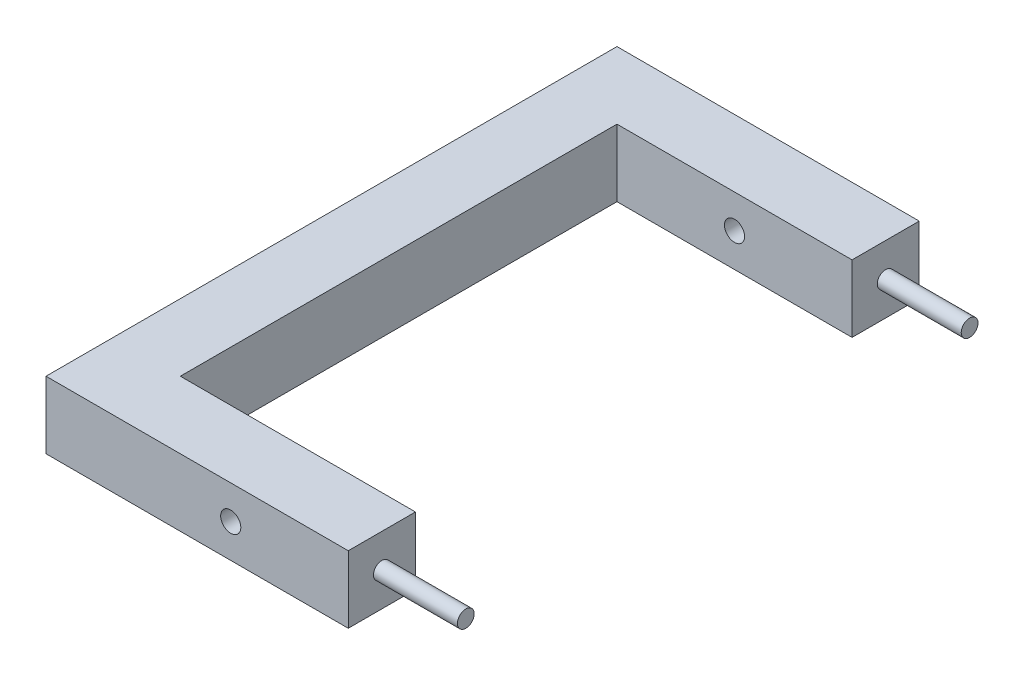
ISO-10303-21;
HEADER;
FILE_DESCRIPTION(('STEP AP214'),'2;1');
FILE_NAME('part.step','',(''),(''),'','','');
FILE_SCHEMA(('AUTOMOTIVE_DESIGN { 1 0 10303 214 1 1 1 1 }'));
ENDSEC;
DATA;
#1=APPLICATION_CONTEXT('core data for automotive mechanical design processes');
#2=APPLICATION_PROTOCOL_DEFINITION('international standard','automotive_design',2000,#1);
#3=PRODUCT_CONTEXT('',#1,'mechanical');
#4=PRODUCT('Part','Part','',(#3));
#5=PRODUCT_RELATED_PRODUCT_CATEGORY('part','',(#4));
#6=PRODUCT_DEFINITION_FORMATION('','',#4);
#7=PRODUCT_DEFINITION_CONTEXT('part definition',#1,'design');
#8=PRODUCT_DEFINITION('design','',#6,#7);
#9=PRODUCT_DEFINITION_SHAPE('','',#8);
#10=(LENGTH_UNIT() NAMED_UNIT(*) SI_UNIT(.MILLI.,.METRE.));
#11=(NAMED_UNIT(*) PLANE_ANGLE_UNIT() SI_UNIT($,.RADIAN.));
#12=(NAMED_UNIT(*) SI_UNIT($,.STERADIAN.) SOLID_ANGLE_UNIT());
#13=UNCERTAINTY_MEASURE_WITH_UNIT(LENGTH_MEASURE(1.E-05),#10,'distance_accuracy_value','');
#14=(GEOMETRIC_REPRESENTATION_CONTEXT(3) GLOBAL_UNCERTAINTY_ASSIGNED_CONTEXT((#13)) GLOBAL_UNIT_ASSIGNED_CONTEXT((#10,
#11,#12)) REPRESENTATION_CONTEXT('',''));
#15=CARTESIAN_POINT('',(0.,0.,0.));
#16=DIRECTION('',(0.,0.,1.));
#17=DIRECTION('',(1.,0.,0.));
#18=AXIS2_PLACEMENT_3D('',#15,#16,#17);
#19=CARTESIAN_POINT('',(0.,40.,-170.));
#20=DIRECTION('',(1.,0.,0.));
#21=DIRECTION('',(0.,0.,-1.));
#22=AXIS2_PLACEMENT_3D('',#19,#20,#21);
#23=PLANE('',#22);
#24=DIRECTION('',(0.,0.,1.));
#25=VECTOR('',#24,1.);
#26=CARTESIAN_POINT('',(0.,0.,-170.));
#27=LINE('',#26,#25);
#28=CARTESIAN_POINT('',(0.,0.,-170.));
#29=VERTEX_POINT('',#28);
#30=CARTESIAN_POINT('',(0.,0.,170.));
#31=VERTEX_POINT('',#30);
#32=EDGE_CURVE('E140',#29,#31,#27,.T.);
#33=ORIENTED_EDGE('',*,*,#32,.T.);
#34=DIRECTION('',(0.,-1.,0.));
#35=VECTOR('',#34,1.);
#36=CARTESIAN_POINT('',(0.,40.,170.));
#37=LINE('',#36,#35);
#38=CARTESIAN_POINT('',(0.,40.,170.));
#39=VERTEX_POINT('',#38);
#40=EDGE_CURVE('E168',#39,#31,#37,.T.);
#41=ORIENTED_EDGE('',*,*,#40,.F.);
#42=DIRECTION('',(0.,0.,1.));
#43=VECTOR('',#42,1.);
#44=CARTESIAN_POINT('',(0.,40.,-170.));
#45=LINE('',#44,#43);
#46=CARTESIAN_POINT('',(0.,40.,-170.));
#47=VERTEX_POINT('',#46);
#48=EDGE_CURVE('E155',#47,#39,#45,.T.);
#49=ORIENTED_EDGE('',*,*,#48,.F.);
#50=DIRECTION('',(0.,-1.,0.));
#51=VECTOR('',#50,1.);
#52=CARTESIAN_POINT('',(0.,40.,-170.));
#53=LINE('',#52,#51);
#54=EDGE_CURVE('E136',#47,#29,#53,.T.);
#55=ORIENTED_EDGE('',*,*,#54,.T.);
#56=EDGE_LOOP('',(#33,#41,#49,#55));
#57=FACE_BOUND('',#56,.T.);
#58=ADVANCED_FACE('F43',(#57),#23,.F.);
#59=CARTESIAN_POINT('',(0.,40.,170.));
#60=DIRECTION('',(0.,0.,-1.));
#61=DIRECTION('',(-1.,0.,0.));
#62=AXIS2_PLACEMENT_3D('',#59,#60,#61);
#63=PLANE('',#62);
#64=CARTESIAN_POINT('',(110.,20.,170.));
#65=DIRECTION('',(0.,0.,1.));
#66=DIRECTION('',(1.,0.,0.));
#67=AXIS2_PLACEMENT_3D('',#64,#65,#66);
#68=CIRCLE('',#67,6.00000000000002);
#69=CARTESIAN_POINT('',(116.,20.,170.));
#70=VERTEX_POINT('',#69);
#71=EDGE_CURVE('E173',#70,#70,#68,.T.);
#72=ORIENTED_EDGE('',*,*,#71,.F.);
#73=EDGE_LOOP('',(#72));
#74=FACE_BOUND('',#73,.T.);
#75=DIRECTION('',(1.,0.,0.));
#76=VECTOR('',#75,1.);
#77=CARTESIAN_POINT('',(0.,0.,170.));
#78=LINE('',#77,#76);
#79=CARTESIAN_POINT('',(180.,0.,170.));
#80=VERTEX_POINT('',#79);
#81=EDGE_CURVE('E143',#31,#80,#78,.T.);
#82=ORIENTED_EDGE('',*,*,#81,.T.);
#83=DIRECTION('',(0.,-1.,0.));
#84=VECTOR('',#83,1.);
#85=CARTESIAN_POINT('',(180.,40.,170.));
#86=LINE('',#85,#84);
#87=CARTESIAN_POINT('',(180.,40.,170.));
#88=VERTEX_POINT('',#87);
#89=EDGE_CURVE('E165',#88,#80,#86,.T.);
#90=ORIENTED_EDGE('',*,*,#89,.F.);
#91=DIRECTION('',(1.,0.,0.));
#92=VECTOR('',#91,1.);
#93=CARTESIAN_POINT('',(0.,40.,170.));
#94=LINE('',#93,#92);
#95=EDGE_CURVE('E103',#39,#88,#94,.T.);
#96=ORIENTED_EDGE('',*,*,#95,.F.);
#97=ORIENTED_EDGE('',*,*,#40,.T.);
#98=EDGE_LOOP('',(#82,#90,#96,#97));
#99=FACE_BOUND('',#98,.T.);
#100=ADVANCED_FACE('F194',(#74,#99),#63,.F.);
#101=CARTESIAN_POINT('',(180.,40.,170.));
#102=DIRECTION('',(-1.,0.,0.));
#103=DIRECTION('',(0.,0.,1.));
#104=AXIS2_PLACEMENT_3D('',#101,#102,#103);
#105=PLANE('',#104);
#106=CARTESIAN_POINT('',(180.,20.,150.));
#107=DIRECTION('',(-1.,0.,0.));
#108=DIRECTION('',(0.,0.,1.));
#109=AXIS2_PLACEMENT_3D('',#106,#107,#108);
#110=CIRCLE('',#109,4.99999999999999);
#111=CARTESIAN_POINT('',(180.,20.,155.));
#112=VERTEX_POINT('',#111);
#113=EDGE_CURVE('E11',#112,#112,#110,.F.);
#114=ORIENTED_EDGE('',*,*,#113,.F.);
#115=EDGE_LOOP('',(#114));
#116=FACE_BOUND('',#115,.T.);
#117=DIRECTION('',(0.,0.,-1.));
#118=VECTOR('',#117,1.);
#119=CARTESIAN_POINT('',(180.,0.,170.));
#120=LINE('',#119,#118);
#121=CARTESIAN_POINT('',(180.,0.,130.));
#122=VERTEX_POINT('',#121);
#123=EDGE_CURVE('E146',#80,#122,#120,.T.);
#124=ORIENTED_EDGE('',*,*,#123,.T.);
#125=DIRECTION('',(0.,-1.,0.));
#126=VECTOR('',#125,1.);
#127=CARTESIAN_POINT('',(180.,40.,130.));
#128=LINE('',#127,#126);
#129=CARTESIAN_POINT('',(180.,40.,130.));
#130=VERTEX_POINT('',#129);
#131=EDGE_CURVE('E162',#130,#122,#128,.T.);
#132=ORIENTED_EDGE('',*,*,#131,.F.);
#133=DIRECTION('',(0.,0.,-1.));
#134=VECTOR('',#133,1.);
#135=CARTESIAN_POINT('',(180.,40.,170.));
#136=LINE('',#135,#134);
#137=EDGE_CURVE('E212',#88,#130,#136,.T.);
#138=ORIENTED_EDGE('',*,*,#137,.F.);
#139=ORIENTED_EDGE('',*,*,#89,.T.);
#140=EDGE_LOOP('',(#124,#132,#138,#139));
#141=FACE_BOUND('',#140,.T.);
#142=ADVANCED_FACE('F200',(#116,#141),#105,.F.);
#143=CARTESIAN_POINT('',(180.,40.,130.));
#144=DIRECTION('',(0.,0.,1.));
#145=DIRECTION('',(1.,0.,0.));
#146=AXIS2_PLACEMENT_3D('',#143,#144,#145);
#147=PLANE('',#146);
#148=CARTESIAN_POINT('',(110.,20.,130.));
#149=DIRECTION('',(0.,0.,1.));
#150=DIRECTION('',(1.,0.,0.));
#151=AXIS2_PLACEMENT_3D('',#148,#149,#150);
#152=CIRCLE('',#151,6.00000000000002);
#153=CARTESIAN_POINT('',(116.,20.,130.));
#154=VERTEX_POINT('',#153);
#155=EDGE_CURVE('E144',#154,#154,#152,.T.);
#156=ORIENTED_EDGE('',*,*,#155,.T.);
#157=EDGE_LOOP('',(#156));
#158=FACE_BOUND('',#157,.T.);
#159=DIRECTION('',(-1.,0.,0.));
#160=VECTOR('',#159,1.);
#161=CARTESIAN_POINT('',(180.,0.,130.));
#162=LINE('',#161,#160);
#163=CARTESIAN_POINT('',(40.,0.,130.));
#164=VERTEX_POINT('',#163);
#165=EDGE_CURVE('E148',#122,#164,#162,.T.);
#166=ORIENTED_EDGE('',*,*,#165,.T.);
#167=DIRECTION('',(0.,-1.,0.));
#168=VECTOR('',#167,1.);
#169=CARTESIAN_POINT('',(40.,40.,130.));
#170=LINE('',#169,#168);
#171=CARTESIAN_POINT('',(40.,40.,130.));
#172=VERTEX_POINT('',#171);
#173=EDGE_CURVE('E159',#172,#164,#170,.T.);
#174=ORIENTED_EDGE('',*,*,#173,.F.);
#175=DIRECTION('',(-1.,0.,0.));
#176=VECTOR('',#175,1.);
#177=CARTESIAN_POINT('',(180.,40.,130.));
#178=LINE('',#177,#176);
#179=EDGE_CURVE('E214',#130,#172,#178,.T.);
#180=ORIENTED_EDGE('',*,*,#179,.F.);
#181=ORIENTED_EDGE('',*,*,#131,.T.);
#182=EDGE_LOOP('',(#166,#174,#180,#181));
#183=FACE_BOUND('',#182,.T.);
#184=ADVANCED_FACE('F242',(#158,#183),#147,.F.);
#185=CARTESIAN_POINT('',(40.,40.,-130.));
#186=DIRECTION('',(-1.,0.,0.));
#187=DIRECTION('',(0.,0.,1.));
#188=AXIS2_PLACEMENT_3D('',#185,#186,#187);
#189=PLANE('',#188);
#190=DIRECTION('',(0.,0.,-1.));
#191=VECTOR('',#190,1.);
#192=CARTESIAN_POINT('',(40.,0.,-130.));
#193=LINE('',#192,#191);
#194=CARTESIAN_POINT('',(40.,0.,-130.));
#195=VERTEX_POINT('',#194);
#196=EDGE_CURVE('E150',#164,#195,#193,.T.);
#197=ORIENTED_EDGE('',*,*,#196,.T.);
#198=DIRECTION('',(0.,-1.,0.));
#199=VECTOR('',#198,1.);
#200=CARTESIAN_POINT('',(40.,40.,-130.));
#201=LINE('',#200,#199);
#202=CARTESIAN_POINT('',(40.,40.,-130.));
#203=VERTEX_POINT('',#202);
#204=EDGE_CURVE('E131',#203,#195,#201,.T.);
#205=ORIENTED_EDGE('',*,*,#204,.F.);
#206=DIRECTION('',(0.,0.,-1.));
#207=VECTOR('',#206,1.);
#208=CARTESIAN_POINT('',(40.,40.,-130.));
#209=LINE('',#208,#207);
#210=EDGE_CURVE('E122',#172,#203,#209,.T.);
#211=ORIENTED_EDGE('',*,*,#210,.F.);
#212=ORIENTED_EDGE('',*,*,#173,.T.);
#213=EDGE_LOOP('',(#197,#205,#211,#212));
#214=FACE_BOUND('',#213,.T.);
#215=ADVANCED_FACE('F190',(#214),#189,.F.);
#216=CARTESIAN_POINT('',(180.,40.,-130.));
#217=DIRECTION('',(0.,0.,-1.));
#218=DIRECTION('',(-1.,0.,0.));
#219=AXIS2_PLACEMENT_3D('',#216,#217,#218);
#220=PLANE('',#219);
#221=CARTESIAN_POINT('',(110.,20.,-130.));
#222=DIRECTION('',(0.,0.,-1.));
#223=DIRECTION('',(-1.,0.,0.));
#224=AXIS2_PLACEMENT_3D('',#221,#222,#223);
#225=CIRCLE('',#224,6.00000000000002);
#226=CARTESIAN_POINT('',(104.,20.,-130.));
#227=VERTEX_POINT('',#226);
#228=EDGE_CURVE('E172',#227,#227,#225,.T.);
#229=ORIENTED_EDGE('',*,*,#228,.T.);
#230=EDGE_LOOP('',(#229));
#231=FACE_BOUND('',#230,.T.);
#232=DIRECTION('',(1.,0.,0.));
#233=VECTOR('',#232,1.);
#234=CARTESIAN_POINT('',(180.,0.,-130.));
#235=LINE('',#234,#233);
#236=CARTESIAN_POINT('',(180.,0.,-130.));
#237=VERTEX_POINT('',#236);
#238=EDGE_CURVE('E130',#195,#237,#235,.T.);
#239=ORIENTED_EDGE('',*,*,#238,.T.);
#240=DIRECTION('',(0.,-1.,0.));
#241=VECTOR('',#240,1.);
#242=CARTESIAN_POINT('',(180.,40.,-130.));
#243=LINE('',#242,#241);
#244=CARTESIAN_POINT('',(180.,40.,-130.));
#245=VERTEX_POINT('',#244);
#246=EDGE_CURVE('E127',#245,#237,#243,.T.);
#247=ORIENTED_EDGE('',*,*,#246,.F.);
#248=DIRECTION('',(1.,0.,0.));
#249=VECTOR('',#248,1.);
#250=CARTESIAN_POINT('',(180.,40.,-130.));
#251=LINE('',#250,#249);
#252=EDGE_CURVE('E116',#203,#245,#251,.T.);
#253=ORIENTED_EDGE('',*,*,#252,.F.);
#254=ORIENTED_EDGE('',*,*,#204,.T.);
#255=EDGE_LOOP('',(#239,#247,#253,#254));
#256=FACE_BOUND('',#255,.T.);
#257=ADVANCED_FACE('F128',(#231,#256),#220,.F.);
#258=CARTESIAN_POINT('',(180.,40.,-170.));
#259=DIRECTION('',(-1.,0.,0.));
#260=DIRECTION('',(0.,0.,1.));
#261=AXIS2_PLACEMENT_3D('',#258,#259,#260);
#262=PLANE('',#261);
#263=CARTESIAN_POINT('',(180.,20.,-150.));
#264=DIRECTION('',(-1.,0.,0.));
#265=DIRECTION('',(0.,0.,1.));
#266=AXIS2_PLACEMENT_3D('',#263,#264,#265);
#267=CIRCLE('',#266,4.99999999999999);
#268=CARTESIAN_POINT('',(180.,20.,-145.));
#269=VERTEX_POINT('',#268);
#270=EDGE_CURVE('E51',#269,#269,#267,.F.);
#271=ORIENTED_EDGE('',*,*,#270,.F.);
#272=EDGE_LOOP('',(#271));
#273=FACE_BOUND('',#272,.T.);
#274=DIRECTION('',(0.,0.,-1.));
#275=VECTOR('',#274,1.);
#276=CARTESIAN_POINT('',(180.,0.,-170.));
#277=LINE('',#276,#275);
#278=CARTESIAN_POINT('',(180.,0.,-170.));
#279=VERTEX_POINT('',#278);
#280=EDGE_CURVE('E88',#237,#279,#277,.T.);
#281=ORIENTED_EDGE('',*,*,#280,.T.);
#282=DIRECTION('',(0.,-1.,0.));
#283=VECTOR('',#282,1.);
#284=CARTESIAN_POINT('',(180.,40.,-170.));
#285=LINE('',#284,#283);
#286=CARTESIAN_POINT('',(180.,40.,-170.));
#287=VERTEX_POINT('',#286);
#288=EDGE_CURVE('E132',#287,#279,#285,.T.);
#289=ORIENTED_EDGE('',*,*,#288,.F.);
#290=DIRECTION('',(0.,0.,-1.));
#291=VECTOR('',#290,1.);
#292=CARTESIAN_POINT('',(180.,40.,-170.));
#293=LINE('',#292,#291);
#294=EDGE_CURVE('E120',#245,#287,#293,.T.);
#295=ORIENTED_EDGE('',*,*,#294,.F.);
#296=ORIENTED_EDGE('',*,*,#246,.T.);
#297=EDGE_LOOP('',(#281,#289,#295,#296));
#298=FACE_BOUND('',#297,.T.);
#299=ADVANCED_FACE('F134',(#273,#298),#262,.F.);
#300=CARTESIAN_POINT('',(0.,40.,-170.));
#301=DIRECTION('',(0.,0.,1.));
#302=DIRECTION('',(1.,0.,0.));
#303=AXIS2_PLACEMENT_3D('',#300,#301,#302);
#304=PLANE('',#303);
#305=CARTESIAN_POINT('',(110.,20.,-170.));
#306=DIRECTION('',(0.,0.,1.));
#307=DIRECTION('',(1.,0.,0.));
#308=AXIS2_PLACEMENT_3D('',#305,#306,#307);
#309=CIRCLE('',#308,6.00000000000002);
#310=CARTESIAN_POINT('',(116.,20.,-170.));
#311=VERTEX_POINT('',#310);
#312=EDGE_CURVE('E170',#311,#311,#309,.T.);
#313=ORIENTED_EDGE('',*,*,#312,.T.);
#314=EDGE_LOOP('',(#313));
#315=FACE_BOUND('',#314,.T.);
#316=DIRECTION('',(-1.,0.,0.));
#317=VECTOR('',#316,1.);
#318=CARTESIAN_POINT('',(0.,0.,-170.));
#319=LINE('',#318,#317);
#320=EDGE_CURVE('E94',#279,#29,#319,.T.);
#321=ORIENTED_EDGE('',*,*,#320,.T.);
#322=ORIENTED_EDGE('',*,*,#54,.F.);
#323=DIRECTION('',(-1.,0.,0.));
#324=VECTOR('',#323,1.);
#325=CARTESIAN_POINT('',(0.,40.,-170.));
#326=LINE('',#325,#324);
#327=EDGE_CURVE('E59',#287,#47,#326,.T.);
#328=ORIENTED_EDGE('',*,*,#327,.F.);
#329=ORIENTED_EDGE('',*,*,#288,.T.);
#330=EDGE_LOOP('',(#321,#322,#328,#329));
#331=FACE_BOUND('',#330,.T.);
#332=ADVANCED_FACE('F180',(#315,#331),#304,.F.);
#333=CARTESIAN_POINT('',(0.,40.,0.));
#334=DIRECTION('',(0.,1.,0.));
#335=DIRECTION('',(0.,0.,1.));
#336=AXIS2_PLACEMENT_3D('',#333,#334,#335);
#337=PLANE('',#336);
#338=ORIENTED_EDGE('',*,*,#48,.T.);
#339=ORIENTED_EDGE('',*,*,#95,.T.);
#340=ORIENTED_EDGE('',*,*,#137,.T.);
#341=ORIENTED_EDGE('',*,*,#179,.T.);
#342=ORIENTED_EDGE('',*,*,#210,.T.);
#343=ORIENTED_EDGE('',*,*,#252,.T.);
#344=ORIENTED_EDGE('',*,*,#294,.T.);
#345=ORIENTED_EDGE('',*,*,#327,.T.);
#346=EDGE_LOOP('',(#338,#339,#340,#341,#342,#343,#344,#345));
#347=FACE_BOUND('',#346,.T.);
#348=ADVANCED_FACE('F118',(#347),#337,.T.);
#349=CARTESIAN_POINT('',(0.,0.,0.));
#350=DIRECTION('',(0.,1.,0.));
#351=DIRECTION('',(0.,0.,1.));
#352=AXIS2_PLACEMENT_3D('',#349,#350,#351);
#353=PLANE('',#352);
#354=ORIENTED_EDGE('',*,*,#32,.F.);
#355=ORIENTED_EDGE('',*,*,#320,.F.);
#356=ORIENTED_EDGE('',*,*,#280,.F.);
#357=ORIENTED_EDGE('',*,*,#238,.F.);
#358=ORIENTED_EDGE('',*,*,#196,.F.);
#359=ORIENTED_EDGE('',*,*,#165,.F.);
#360=ORIENTED_EDGE('',*,*,#123,.F.);
#361=ORIENTED_EDGE('',*,*,#81,.F.);
#362=EDGE_LOOP('',(#354,#355,#356,#357,#358,#359,#360,#361));
#363=FACE_BOUND('',#362,.T.);
#364=ADVANCED_FACE('F206',(#363),#353,.F.);
#365=CARTESIAN_POINT('',(110.,20.,-225.));
#366=DIRECTION('',(0.,0.,1.));
#367=DIRECTION('',(1.,0.,0.));
#368=AXIS2_PLACEMENT_3D('',#365,#366,#367);
#369=CYLINDRICAL_SURFACE('',#368,6.00000000000002);
#370=ORIENTED_EDGE('',*,*,#312,.F.);
#371=EDGE_LOOP('',(#370));
#372=FACE_BOUND('',#371,.T.);
#373=ORIENTED_EDGE('',*,*,#228,.F.);
#374=EDGE_LOOP('',(#373));
#375=FACE_BOUND('',#374,.T.);
#376=ADVANCED_FACE('F273',(#372,#375),#369,.F.);
#377=ORIENTED_EDGE('',*,*,#71,.T.);
#378=EDGE_LOOP('',(#377));
#379=FACE_BOUND('',#378,.T.);
#380=ORIENTED_EDGE('',*,*,#155,.F.);
#381=EDGE_LOOP('',(#380));
#382=FACE_BOUND('',#381,.T.);
#383=ADVANCED_FACE('F298',(#379,#382),#369,.F.);
#384=CARTESIAN_POINT('',(230.,20.,-150.));
#385=DIRECTION('',(-1.,0.,0.));
#386=DIRECTION('',(0.,0.,1.));
#387=AXIS2_PLACEMENT_3D('',#384,#385,#386);
#388=CYLINDRICAL_SURFACE('',#387,4.99999999999999);
#389=CARTESIAN_POINT('',(230.,20.,-150.));
#390=DIRECTION('',(1.,0.,0.));
#391=DIRECTION('',(0.,0.,1.));
#392=AXIS2_PLACEMENT_3D('',#389,#390,#391);
#393=CIRCLE('',#392,4.99999999999999);
#394=CARTESIAN_POINT('',(230.,20.,-145.));
#395=VERTEX_POINT('',#394);
#396=EDGE_CURVE('E227',#395,#395,#393,.T.);
#397=ORIENTED_EDGE('',*,*,#396,.F.);
#398=EDGE_LOOP('',(#397));
#399=FACE_BOUND('',#398,.T.);
#400=ORIENTED_EDGE('',*,*,#270,.T.);
#401=EDGE_LOOP('',(#400));
#402=FACE_BOUND('',#401,.T.);
#403=ADVANCED_FACE('F177',(#399,#402),#388,.T.);
#404=CARTESIAN_POINT('',(230.,20.,-150.));
#405=DIRECTION('',(-1.,0.,0.));
#406=DIRECTION('',(0.,0.,1.));
#407=AXIS2_PLACEMENT_3D('',#404,#405,#406);
#408=PLANE('',#407);
#409=ORIENTED_EDGE('',*,*,#396,.T.);
#410=EDGE_LOOP('',(#409));
#411=FACE_BOUND('',#410,.T.);
#412=ADVANCED_FACE('F238',(#411),#408,.F.);
#413=CARTESIAN_POINT('',(230.,20.,150.));
#414=DIRECTION('',(-1.,0.,0.));
#415=DIRECTION('',(0.,0.,1.));
#416=AXIS2_PLACEMENT_3D('',#413,#414,#415);
#417=CYLINDRICAL_SURFACE('',#416,4.99999999999999);
#418=CARTESIAN_POINT('',(230.,20.,150.));
#419=DIRECTION('',(1.,0.,0.));
#420=DIRECTION('',(0.,0.,-1.));
#421=AXIS2_PLACEMENT_3D('',#418,#419,#420);
#422=CIRCLE('',#421,4.99999999999999);
#423=CARTESIAN_POINT('',(230.,20.,145.));
#424=VERTEX_POINT('',#423);
#425=EDGE_CURVE('E226',#424,#424,#422,.T.);
#426=ORIENTED_EDGE('',*,*,#425,.F.);
#427=EDGE_LOOP('',(#426));
#428=FACE_BOUND('',#427,.T.);
#429=ORIENTED_EDGE('',*,*,#113,.T.);
#430=EDGE_LOOP('',(#429));
#431=FACE_BOUND('',#430,.T.);
#432=ADVANCED_FACE('F235',(#428,#431),#417,.T.);
#433=CARTESIAN_POINT('',(230.,20.,150.));
#434=DIRECTION('',(1.,0.,0.));
#435=DIRECTION('',(0.,0.,-1.));
#436=AXIS2_PLACEMENT_3D('',#433,#434,#435);
#437=PLANE('',#436);
#438=ORIENTED_EDGE('',*,*,#425,.T.);
#439=EDGE_LOOP('',(#438));
#440=FACE_BOUND('',#439,.T.);
#441=ADVANCED_FACE('F233',(#440),#437,.T.);
#442=CLOSED_SHELL('',(#58,#100,#142,#184,#215,#257,#299,#332,#348,#364,#376,#383,#403,#412,#432,#441));
#443=MANIFOLD_SOLID_BREP('B2',#442);
#444=ADVANCED_BREP_SHAPE_REPRESENTATION('',(#18,#443),#14);
#445=SHAPE_DEFINITION_REPRESENTATION(#9,#444);
ENDSEC;
END-ISO-10303-21;
